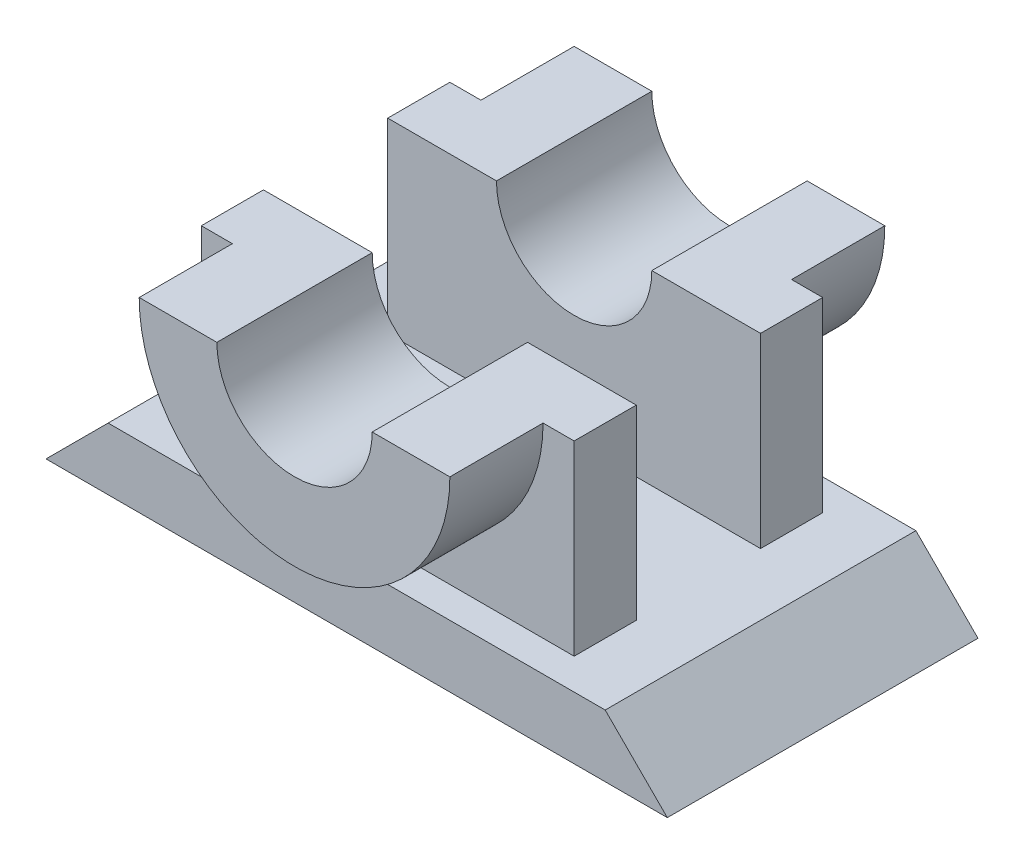
ISO-10303-21;
HEADER;
FILE_DESCRIPTION(('STEP AP214'),'2;1');
FILE_NAME('part.step','',(''),(''),'','','');
FILE_SCHEMA(('AUTOMOTIVE_DESIGN { 1 0 10303 214 1 1 1 1 }'));
ENDSEC;
DATA;
#1=APPLICATION_CONTEXT('core data for automotive mechanical design processes');
#2=APPLICATION_PROTOCOL_DEFINITION('international standard','automotive_design',2000,#1);
#3=PRODUCT_CONTEXT('',#1,'mechanical');
#4=PRODUCT('Part','Part','',(#3));
#5=PRODUCT_RELATED_PRODUCT_CATEGORY('part','',(#4));
#6=PRODUCT_DEFINITION_FORMATION('','',#4);
#7=PRODUCT_DEFINITION_CONTEXT('part definition',#1,'design');
#8=PRODUCT_DEFINITION('design','',#6,#7);
#9=PRODUCT_DEFINITION_SHAPE('','',#8);
#10=(LENGTH_UNIT() NAMED_UNIT(*) SI_UNIT(.MILLI.,.METRE.));
#11=(NAMED_UNIT(*) PLANE_ANGLE_UNIT() SI_UNIT($,.RADIAN.));
#12=(NAMED_UNIT(*) SI_UNIT($,.STERADIAN.) SOLID_ANGLE_UNIT());
#13=UNCERTAINTY_MEASURE_WITH_UNIT(LENGTH_MEASURE(1.E-05),#10,'distance_accuracy_value','');
#14=(GEOMETRIC_REPRESENTATION_CONTEXT(3) GLOBAL_UNCERTAINTY_ASSIGNED_CONTEXT((#13)) GLOBAL_UNIT_ASSIGNED_CONTEXT((#10,
#11,#12)) REPRESENTATION_CONTEXT('',''));
#15=CARTESIAN_POINT('',(0.,0.,0.));
#16=DIRECTION('',(0.,0.,1.));
#17=DIRECTION('',(1.,0.,0.));
#18=AXIS2_PLACEMENT_3D('',#15,#16,#17);
#19=CARTESIAN_POINT('',(-30.,40.,-20.));
#20=DIRECTION('',(0.,0.,1.));
#21=DIRECTION('',(1.,0.,0.));
#22=AXIS2_PLACEMENT_3D('',#19,#20,#21);
#23=PLANE('',#22);
#24=CARTESIAN_POINT('',(0.,40.,-20.));
#25=DIRECTION('',(0.,0.,-1.));
#26=DIRECTION('',(-1.,0.,0.));
#27=AXIS2_PLACEMENT_3D('',#24,#25,#26);
#28=CIRCLE('',#27,25.);
#29=CARTESIAN_POINT('',(25.,40.,-20.));
#30=VERTEX_POINT('',#29);
#31=CARTESIAN_POINT('',(-25.,40.,-20.));
#32=VERTEX_POINT('',#31);
#33=EDGE_CURVE('E56',#30,#32,#28,.T.);
#34=ORIENTED_EDGE('',*,*,#33,.F.);
#35=DIRECTION('',(-1.,0.,0.));
#36=VECTOR('',#35,1.);
#37=CARTESIAN_POINT('',(-30.,40.,-20.));
#38=LINE('',#37,#36);
#39=CARTESIAN_POINT('',(30.,40.,-20.));
#40=VERTEX_POINT('',#39);
#41=EDGE_CURVE('E280',#40,#30,#38,.T.);
#42=ORIENTED_EDGE('',*,*,#41,.F.);
#43=DIRECTION('',(0.,-1.,0.));
#44=VECTOR('',#43,1.);
#45=CARTESIAN_POINT('',(30.,40.,-20.));
#46=LINE('',#45,#44);
#47=CARTESIAN_POINT('',(30.,10.,-20.));
#48=VERTEX_POINT('',#47);
#49=EDGE_CURVE('E266',#40,#48,#46,.T.);
#50=ORIENTED_EDGE('',*,*,#49,.T.);
#51=DIRECTION('',(1.,0.,0.));
#52=VECTOR('',#51,1.);
#53=CARTESIAN_POINT('',(0.,10.,-20.));
#54=LINE('',#53,#52);
#55=CARTESIAN_POINT('',(-30.,10.,-20.));
#56=VERTEX_POINT('',#55);
#57=EDGE_CURVE('E281',#56,#48,#54,.T.);
#58=ORIENTED_EDGE('',*,*,#57,.F.);
#59=DIRECTION('',(0.,-1.,0.));
#60=VECTOR('',#59,1.);
#61=CARTESIAN_POINT('',(-30.,40.,-20.));
#62=LINE('',#61,#60);
#63=CARTESIAN_POINT('',(-30.,40.,-20.));
#64=VERTEX_POINT('',#63);
#65=EDGE_CURVE('E267',#64,#56,#62,.T.);
#66=ORIENTED_EDGE('',*,*,#65,.F.);
#67=EDGE_CURVE('E277',#32,#64,#38,.T.);
#68=ORIENTED_EDGE('',*,*,#67,.F.);
#69=EDGE_LOOP('',(#34,#42,#50,#58,#66,#68));
#70=FACE_BOUND('',#69,.T.);
#71=ADVANCED_FACE('F43',(#70),#23,.F.);
#72=CARTESIAN_POINT('',(-30.,40.,20.));
#73=DIRECTION('',(0.,0.,-1.));
#74=DIRECTION('',(-1.,0.,0.));
#75=AXIS2_PLACEMENT_3D('',#72,#73,#74);
#76=PLANE('',#75);
#77=CARTESIAN_POINT('',(0.,40.,20.));
#78=DIRECTION('',(0.,0.,1.));
#79=DIRECTION('',(1.,0.,0.));
#80=AXIS2_PLACEMENT_3D('',#77,#78,#79);
#81=CIRCLE('',#80,25.);
#82=CARTESIAN_POINT('',(-25.,40.,20.));
#83=VERTEX_POINT('',#82);
#84=CARTESIAN_POINT('',(25.,40.,20.));
#85=VERTEX_POINT('',#84);
#86=EDGE_CURVE('E70',#83,#85,#81,.T.);
#87=ORIENTED_EDGE('',*,*,#86,.F.);
#88=DIRECTION('',(1.,0.,0.));
#89=VECTOR('',#88,1.);
#90=CARTESIAN_POINT('',(-30.,40.,20.));
#91=LINE('',#90,#89);
#92=CARTESIAN_POINT('',(-30.,40.,20.));
#93=VERTEX_POINT('',#92);
#94=EDGE_CURVE('E249',#93,#83,#91,.T.);
#95=ORIENTED_EDGE('',*,*,#94,.F.);
#96=DIRECTION('',(0.,-1.,0.));
#97=VECTOR('',#96,1.);
#98=CARTESIAN_POINT('',(-30.,40.,20.));
#99=LINE('',#98,#97);
#100=CARTESIAN_POINT('',(-30.,10.,20.));
#101=VERTEX_POINT('',#100);
#102=EDGE_CURVE('E254',#93,#101,#99,.T.);
#103=ORIENTED_EDGE('',*,*,#102,.T.);
#104=DIRECTION('',(-1.,0.,0.));
#105=VECTOR('',#104,1.);
#106=CARTESIAN_POINT('',(0.,10.,20.));
#107=LINE('',#106,#105);
#108=CARTESIAN_POINT('',(30.,10.,20.));
#109=VERTEX_POINT('',#108);
#110=EDGE_CURVE('E294',#109,#101,#107,.T.);
#111=ORIENTED_EDGE('',*,*,#110,.F.);
#112=DIRECTION('',(0.,-1.,0.));
#113=VECTOR('',#112,1.);
#114=CARTESIAN_POINT('',(30.,40.,20.));
#115=LINE('',#114,#113);
#116=CARTESIAN_POINT('',(30.,40.,20.));
#117=VERTEX_POINT('',#116);
#118=EDGE_CURVE('E252',#117,#109,#115,.T.);
#119=ORIENTED_EDGE('',*,*,#118,.F.);
#120=EDGE_CURVE('E248',#85,#117,#91,.T.);
#121=ORIENTED_EDGE('',*,*,#120,.F.);
#122=EDGE_LOOP('',(#87,#95,#103,#111,#119,#121));
#123=FACE_BOUND('',#122,.T.);
#124=ADVANCED_FACE('F365',(#123),#76,.F.);
#125=CARTESIAN_POINT('',(0.,40.,0.));
#126=DIRECTION('',(0.,1.,0.));
#127=DIRECTION('',(0.,0.,1.));
#128=AXIS2_PLACEMENT_3D('',#125,#126,#127);
#129=PLANE('',#128);
#130=ORIENTED_EDGE('',*,*,#41,.T.);
#131=DIRECTION('',(0.,0.,1.));
#132=VECTOR('',#131,1.);
#133=CARTESIAN_POINT('',(25.,40.,-35.));
#134=LINE('',#133,#132);
#135=CARTESIAN_POINT('',(25.,40.,-35.));
#136=VERTEX_POINT('',#135);
#137=EDGE_CURVE('E204',#136,#30,#134,.T.);
#138=ORIENTED_EDGE('',*,*,#137,.F.);
#139=DIRECTION('',(1.,0.,0.));
#140=VECTOR('',#139,1.);
#141=CARTESIAN_POINT('',(12.5,40.,-35.));
#142=LINE('',#141,#140);
#143=CARTESIAN_POINT('',(12.5,40.,-35.));
#144=VERTEX_POINT('',#143);
#145=EDGE_CURVE('E196',#144,#136,#142,.T.);
#146=ORIENTED_EDGE('',*,*,#145,.F.);
#147=DIRECTION('',(0.,0.,1.));
#148=VECTOR('',#147,1.);
#149=CARTESIAN_POINT('',(12.5,40.,-44.));
#150=LINE('',#149,#148);
#151=CARTESIAN_POINT('',(12.5,40.,-9.99999999999999));
#152=VERTEX_POINT('',#151);
#153=EDGE_CURVE('E226',#144,#152,#150,.T.);
#154=ORIENTED_EDGE('',*,*,#153,.T.);
#155=DIRECTION('',(1.,0.,0.));
#156=VECTOR('',#155,1.);
#157=CARTESIAN_POINT('',(-30.,40.,-9.99999999999999));
#158=LINE('',#157,#156);
#159=CARTESIAN_POINT('',(30.,40.,-9.99999999999999));
#160=VERTEX_POINT('',#159);
#161=EDGE_CURVE('E283',#152,#160,#158,.T.);
#162=ORIENTED_EDGE('',*,*,#161,.T.);
#163=DIRECTION('',(0.,0.,-1.));
#164=VECTOR('',#163,1.);
#165=CARTESIAN_POINT('',(30.,40.,-9.99999999999999));
#166=LINE('',#165,#164);
#167=EDGE_CURVE('E276',#160,#40,#166,.T.);
#168=ORIENTED_EDGE('',*,*,#167,.T.);
#169=EDGE_LOOP('',(#130,#138,#146,#154,#162,#168));
#170=FACE_BOUND('',#169,.T.);
#171=ADVANCED_FACE('F371',(#170),#129,.T.);
#172=CARTESIAN_POINT('',(0.,40.,0.));
#173=DIRECTION('',(0.,1.,0.));
#174=DIRECTION('',(0.,0.,1.));
#175=AXIS2_PLACEMENT_3D('',#172,#173,#174);
#176=PLANE('',#175);
#177=DIRECTION('',(-1.,0.,0.));
#178=VECTOR('',#177,1.);
#179=CARTESIAN_POINT('',(-30.,40.,9.99999999999999));
#180=LINE('',#179,#178);
#181=CARTESIAN_POINT('',(30.,40.,9.99999999999999));
#182=VERTEX_POINT('',#181);
#183=CARTESIAN_POINT('',(12.5,40.,9.99999999999999));
#184=VERTEX_POINT('',#183);
#185=EDGE_CURVE('E245',#182,#184,#180,.T.);
#186=ORIENTED_EDGE('',*,*,#185,.T.);
#187=CARTESIAN_POINT('',(12.5,40.,35.));
#188=VERTEX_POINT('',#187);
#189=EDGE_CURVE('E229',#184,#188,#150,.T.);
#190=ORIENTED_EDGE('',*,*,#189,.T.);
#191=DIRECTION('',(-1.,0.,0.));
#192=VECTOR('',#191,1.);
#193=CARTESIAN_POINT('',(12.5,40.,35.));
#194=LINE('',#193,#192);
#195=CARTESIAN_POINT('',(25.,40.,35.));
#196=VERTEX_POINT('',#195);
#197=EDGE_CURVE('E213',#196,#188,#194,.T.);
#198=ORIENTED_EDGE('',*,*,#197,.F.);
#199=DIRECTION('',(0.,0.,-1.));
#200=VECTOR('',#199,1.);
#201=CARTESIAN_POINT('',(25.,40.,35.));
#202=LINE('',#201,#200);
#203=EDGE_CURVE('E221',#196,#85,#202,.T.);
#204=ORIENTED_EDGE('',*,*,#203,.T.);
#205=ORIENTED_EDGE('',*,*,#120,.T.);
#206=DIRECTION('',(0.,0.,-1.));
#207=VECTOR('',#206,1.);
#208=CARTESIAN_POINT('',(30.,40.,9.99999999999999));
#209=LINE('',#208,#207);
#210=EDGE_CURVE('E239',#117,#182,#209,.T.);
#211=ORIENTED_EDGE('',*,*,#210,.T.);
#212=EDGE_LOOP('',(#186,#190,#198,#204,#205,#211));
#213=FACE_BOUND('',#212,.T.);
#214=ADVANCED_FACE('F384',(#213),#176,.T.);
#215=CARTESIAN_POINT('',(0.,10.,0.));
#216=DIRECTION('',(0.,1.,0.));
#217=DIRECTION('',(0.,0.,1.));
#218=AXIS2_PLACEMENT_3D('',#215,#216,#217);
#219=PLANE('',#218);
#220=DIRECTION('',(1.,0.,0.));
#221=VECTOR('',#220,1.);
#222=CARTESIAN_POINT('',(-50.,10.,25.));
#223=LINE('',#222,#221);
#224=CARTESIAN_POINT('',(-40.,10.,25.));
#225=VERTEX_POINT('',#224);
#226=CARTESIAN_POINT('',(40.,10.,25.));
#227=VERTEX_POINT('',#226);
#228=EDGE_CURVE('E310',#225,#227,#223,.T.);
#229=ORIENTED_EDGE('',*,*,#228,.T.);
#230=DIRECTION('',(0.,0.,-1.));
#231=VECTOR('',#230,1.);
#232=CARTESIAN_POINT('',(40.,10.,-25.));
#233=LINE('',#232,#231);
#234=CARTESIAN_POINT('',(40.,10.,-25.));
#235=VERTEX_POINT('',#234);
#236=EDGE_CURVE('E328',#227,#235,#233,.T.);
#237=ORIENTED_EDGE('',*,*,#236,.T.);
#238=DIRECTION('',(-1.,0.,0.));
#239=VECTOR('',#238,1.);
#240=CARTESIAN_POINT('',(-50.,10.,-25.));
#241=LINE('',#240,#239);
#242=CARTESIAN_POINT('',(-40.,10.,-25.));
#243=VERTEX_POINT('',#242);
#244=EDGE_CURVE('E307',#235,#243,#241,.T.);
#245=ORIENTED_EDGE('',*,*,#244,.T.);
#246=DIRECTION('',(0.,0.,1.));
#247=VECTOR('',#246,1.);
#248=CARTESIAN_POINT('',(-40.,10.,25.));
#249=LINE('',#248,#247);
#250=EDGE_CURVE('E311',#243,#225,#249,.T.);
#251=ORIENTED_EDGE('',*,*,#250,.T.);
#252=EDGE_LOOP('',(#229,#237,#245,#251));
#253=FACE_BOUND('',#252,.T.);
#254=DIRECTION('',(0.,0.,1.));
#255=VECTOR('',#254,1.);
#256=CARTESIAN_POINT('',(30.,10.,0.));
#257=LINE('',#256,#255);
#258=CARTESIAN_POINT('',(30.,10.,-9.99999999999999));
#259=VERTEX_POINT('',#258);
#260=EDGE_CURVE('E287',#48,#259,#257,.T.);
#261=ORIENTED_EDGE('',*,*,#260,.T.);
#262=DIRECTION('',(-1.,0.,0.));
#263=VECTOR('',#262,1.);
#264=CARTESIAN_POINT('',(0.,10.,-9.99999999999999));
#265=LINE('',#264,#263);
#266=CARTESIAN_POINT('',(-30.,10.,-9.99999999999999));
#267=VERTEX_POINT('',#266);
#268=EDGE_CURVE('E292',#259,#267,#265,.T.);
#269=ORIENTED_EDGE('',*,*,#268,.T.);
#270=DIRECTION('',(0.,0.,-1.));
#271=VECTOR('',#270,1.);
#272=CARTESIAN_POINT('',(-30.,10.,0.));
#273=LINE('',#272,#271);
#274=EDGE_CURVE('E263',#267,#56,#273,.T.);
#275=ORIENTED_EDGE('',*,*,#274,.T.);
#276=ORIENTED_EDGE('',*,*,#57,.T.);
#277=EDGE_LOOP('',(#261,#269,#275,#276));
#278=FACE_BOUND('',#277,.T.);
#279=DIRECTION('',(1.,0.,0.));
#280=VECTOR('',#279,1.);
#281=CARTESIAN_POINT('',(0.,10.,9.99999999999999));
#282=LINE('',#281,#280);
#283=CARTESIAN_POINT('',(-30.,10.,9.99999999999999));
#284=VERTEX_POINT('',#283);
#285=CARTESIAN_POINT('',(30.,10.,9.99999999999999));
#286=VERTEX_POINT('',#285);
#287=EDGE_CURVE('E296',#284,#286,#282,.T.);
#288=ORIENTED_EDGE('',*,*,#287,.T.);
#289=DIRECTION('',(0.,0.,1.));
#290=VECTOR('',#289,1.);
#291=CARTESIAN_POINT('',(30.,10.,0.));
#292=LINE('',#291,#290);
#293=EDGE_CURVE('E302',#286,#109,#292,.T.);
#294=ORIENTED_EDGE('',*,*,#293,.T.);
#295=ORIENTED_EDGE('',*,*,#110,.T.);
#296=DIRECTION('',(0.,0.,-1.));
#297=VECTOR('',#296,1.);
#298=CARTESIAN_POINT('',(-30.,10.,0.));
#299=LINE('',#298,#297);
#300=EDGE_CURVE('E299',#101,#284,#299,.T.);
#301=ORIENTED_EDGE('',*,*,#300,.T.);
#302=EDGE_LOOP('',(#288,#294,#295,#301));
#303=FACE_BOUND('',#302,.T.);
#304=ADVANCED_FACE('F346',(#253,#278,#303),#219,.T.);
#305=CARTESIAN_POINT('',(-50.,10.,-25.));
#306=DIRECTION('',(0.,0.,1.));
#307=DIRECTION('',(1.,0.,0.));
#308=AXIS2_PLACEMENT_3D('',#305,#306,#307);
#309=PLANE('',#308);
#310=ORIENTED_EDGE('',*,*,#244,.F.);
#311=DIRECTION('',(0.707106781186546,-0.707106781186549,0.));
#312=VECTOR('',#311,1.);
#313=CARTESIAN_POINT('',(40.,10.,-25.));
#314=LINE('',#313,#312);
#315=CARTESIAN_POINT('',(50.,0.,-25.));
#316=VERTEX_POINT('',#315);
#317=EDGE_CURVE('E55',#235,#316,#314,.T.);
#318=ORIENTED_EDGE('',*,*,#317,.T.);
#319=DIRECTION('',(-1.,0.,0.));
#320=VECTOR('',#319,1.);
#321=CARTESIAN_POINT('',(-50.,0.,-25.));
#322=LINE('',#321,#320);
#323=CARTESIAN_POINT('',(-50.,0.,-25.));
#324=VERTEX_POINT('',#323);
#325=EDGE_CURVE('E316',#316,#324,#322,.T.);
#326=ORIENTED_EDGE('',*,*,#325,.T.);
#327=DIRECTION('',(0.707106781186547,0.707106781186549,0.));
#328=VECTOR('',#327,1.);
#329=CARTESIAN_POINT('',(-40.,10.,-25.));
#330=LINE('',#329,#328);
#331=EDGE_CURVE('E326',#324,#243,#330,.T.);
#332=ORIENTED_EDGE('',*,*,#331,.T.);
#333=EDGE_LOOP('',(#310,#318,#326,#332));
#334=FACE_BOUND('',#333,.T.);
#335=ADVANCED_FACE('F331',(#334),#309,.F.);
#336=CARTESIAN_POINT('',(-50.,10.,25.));
#337=DIRECTION('',(0.,0.,-1.));
#338=DIRECTION('',(-1.,0.,0.));
#339=AXIS2_PLACEMENT_3D('',#336,#337,#338);
#340=PLANE('',#339);
#341=DIRECTION('',(1.,0.,0.));
#342=VECTOR('',#341,1.);
#343=CARTESIAN_POINT('',(-50.,0.,25.));
#344=LINE('',#343,#342);
#345=CARTESIAN_POINT('',(-50.,0.,25.));
#346=VERTEX_POINT('',#345);
#347=CARTESIAN_POINT('',(50.,0.,25.));
#348=VERTEX_POINT('',#347);
#349=EDGE_CURVE('E309',#346,#348,#344,.T.);
#350=ORIENTED_EDGE('',*,*,#349,.T.);
#351=DIRECTION('',(-0.707106781186546,0.707106781186549,0.));
#352=VECTOR('',#351,1.);
#353=CARTESIAN_POINT('',(40.,10.,25.));
#354=LINE('',#353,#352);
#355=EDGE_CURVE('E11',#348,#227,#354,.T.);
#356=ORIENTED_EDGE('',*,*,#355,.T.);
#357=ORIENTED_EDGE('',*,*,#228,.F.);
#358=DIRECTION('',(-0.707106781186547,-0.707106781186549,0.));
#359=VECTOR('',#358,1.);
#360=CARTESIAN_POINT('',(-40.,10.,25.));
#361=LINE('',#360,#359);
#362=EDGE_CURVE('E322',#225,#346,#361,.T.);
#363=ORIENTED_EDGE('',*,*,#362,.T.);
#364=EDGE_LOOP('',(#350,#356,#357,#363));
#365=FACE_BOUND('',#364,.T.);
#366=ADVANCED_FACE('F347',(#365),#340,.F.);
#367=CARTESIAN_POINT('',(0.,0.,0.));
#368=DIRECTION('',(0.,1.,0.));
#369=DIRECTION('',(0.,0.,1.));
#370=AXIS2_PLACEMENT_3D('',#367,#368,#369);
#371=PLANE('',#370);
#372=DIRECTION('',(0.,0.,-1.));
#373=VECTOR('',#372,1.);
#374=CARTESIAN_POINT('',(50.,0.,-25.));
#375=LINE('',#374,#373);
#376=EDGE_CURVE('E308',#348,#316,#375,.T.);
#377=ORIENTED_EDGE('',*,*,#376,.F.);
#378=ORIENTED_EDGE('',*,*,#349,.F.);
#379=DIRECTION('',(0.,0.,1.));
#380=VECTOR('',#379,1.);
#381=CARTESIAN_POINT('',(-50.,0.,-25.));
#382=LINE('',#381,#380);
#383=EDGE_CURVE('E318',#324,#346,#382,.T.);
#384=ORIENTED_EDGE('',*,*,#383,.F.);
#385=ORIENTED_EDGE('',*,*,#325,.F.);
#386=EDGE_LOOP('',(#377,#378,#384,#385));
#387=FACE_BOUND('',#386,.T.);
#388=ADVANCED_FACE('F336',(#387),#371,.F.);
#389=CARTESIAN_POINT('',(-40.,10.,0.));
#390=DIRECTION('',(-0.707106781186549,0.707106781186547,0.));
#391=DIRECTION('',(0.,0.,-1.));
#392=AXIS2_PLACEMENT_3D('',#389,#390,#391);
#393=PLANE('',#392);
#394=ORIENTED_EDGE('',*,*,#331,.F.);
#395=ORIENTED_EDGE('',*,*,#383,.T.);
#396=ORIENTED_EDGE('',*,*,#362,.F.);
#397=ORIENTED_EDGE('',*,*,#250,.F.);
#398=EDGE_LOOP('',(#394,#395,#396,#397));
#399=FACE_BOUND('',#398,.T.);
#400=ADVANCED_FACE('F354',(#399),#393,.T.);
#401=CARTESIAN_POINT('',(40.,10.,0.));
#402=DIRECTION('',(0.707106781186549,0.707106781186546,0.));
#403=DIRECTION('',(0.,0.,1.));
#404=AXIS2_PLACEMENT_3D('',#401,#402,#403);
#405=PLANE('',#404);
#406=ORIENTED_EDGE('',*,*,#355,.F.);
#407=ORIENTED_EDGE('',*,*,#376,.T.);
#408=ORIENTED_EDGE('',*,*,#317,.F.);
#409=ORIENTED_EDGE('',*,*,#236,.F.);
#410=EDGE_LOOP('',(#406,#407,#408,#409));
#411=FACE_BOUND('',#410,.T.);
#412=ADVANCED_FACE('F46',(#411),#405,.T.);
#413=CARTESIAN_POINT('',(-30.,40.,-9.99999999999999));
#414=DIRECTION('',(0.,0.,-1.));
#415=DIRECTION('',(-1.,0.,0.));
#416=AXIS2_PLACEMENT_3D('',#413,#414,#415);
#417=PLANE('',#416);
#418=ORIENTED_EDGE('',*,*,#161,.F.);
#419=CARTESIAN_POINT('',(0.,40.,-9.99999999999999));
#420=DIRECTION('',(0.,0.,-1.));
#421=DIRECTION('',(-1.,0.,0.));
#422=AXIS2_PLACEMENT_3D('',#419,#420,#421);
#423=CIRCLE('',#422,12.5);
#424=CARTESIAN_POINT('',(-12.5,40.,-9.99999999999999));
#425=VERTEX_POINT('',#424);
#426=EDGE_CURVE('E234',#152,#425,#423,.T.);
#427=ORIENTED_EDGE('',*,*,#426,.T.);
#428=CARTESIAN_POINT('',(-30.,40.,-9.99999999999999));
#429=VERTEX_POINT('',#428);
#430=EDGE_CURVE('E242',#429,#425,#158,.T.);
#431=ORIENTED_EDGE('',*,*,#430,.F.);
#432=DIRECTION('',(0.,-1.,0.));
#433=VECTOR('',#432,1.);
#434=CARTESIAN_POINT('',(-30.,40.,-9.99999999999999));
#435=LINE('',#434,#433);
#436=EDGE_CURVE('E271',#429,#267,#435,.T.);
#437=ORIENTED_EDGE('',*,*,#436,.T.);
#438=ORIENTED_EDGE('',*,*,#268,.F.);
#439=DIRECTION('',(0.,-1.,0.));
#440=VECTOR('',#439,1.);
#441=CARTESIAN_POINT('',(30.,40.,-9.99999999999999));
#442=LINE('',#441,#440);
#443=EDGE_CURVE('E236',#160,#259,#442,.T.);
#444=ORIENTED_EDGE('',*,*,#443,.F.);
#445=EDGE_LOOP('',(#418,#427,#431,#437,#438,#444));
#446=FACE_BOUND('',#445,.T.);
#447=ADVANCED_FACE('F357',(#446),#417,.F.);
#448=CARTESIAN_POINT('',(30.,40.,-9.99999999999999));
#449=DIRECTION('',(-1.,0.,0.));
#450=DIRECTION('',(0.,0.,1.));
#451=AXIS2_PLACEMENT_3D('',#448,#449,#450);
#452=PLANE('',#451);
#453=ORIENTED_EDGE('',*,*,#260,.F.);
#454=ORIENTED_EDGE('',*,*,#49,.F.);
#455=ORIENTED_EDGE('',*,*,#167,.F.);
#456=ORIENTED_EDGE('',*,*,#443,.T.);
#457=EDGE_LOOP('',(#453,#454,#455,#456));
#458=FACE_BOUND('',#457,.T.);
#459=ADVANCED_FACE('F374',(#458),#452,.F.);
#460=CARTESIAN_POINT('',(-30.,40.,-9.99999999999999));
#461=DIRECTION('',(1.,0.,0.));
#462=DIRECTION('',(0.,0.,-1.));
#463=AXIS2_PLACEMENT_3D('',#460,#461,#462);
#464=PLANE('',#463);
#465=ORIENTED_EDGE('',*,*,#274,.F.);
#466=ORIENTED_EDGE('',*,*,#436,.F.);
#467=DIRECTION('',(0.,0.,1.));
#468=VECTOR('',#467,1.);
#469=CARTESIAN_POINT('',(-30.,40.,-9.99999999999999));
#470=LINE('',#469,#468);
#471=EDGE_CURVE('E273',#64,#429,#470,.T.);
#472=ORIENTED_EDGE('',*,*,#471,.F.);
#473=ORIENTED_EDGE('',*,*,#65,.T.);
#474=EDGE_LOOP('',(#465,#466,#472,#473));
#475=FACE_BOUND('',#474,.T.);
#476=ADVANCED_FACE('F380',(#475),#464,.F.);
#477=DIRECTION('',(0.,0.,1.));
#478=VECTOR('',#477,1.);
#479=CARTESIAN_POINT('',(-12.5,40.,-44.));
#480=LINE('',#479,#478);
#481=CARTESIAN_POINT('',(-12.5,40.,-35.));
#482=VERTEX_POINT('',#481);
#483=EDGE_CURVE('E187',#482,#425,#480,.T.);
#484=ORIENTED_EDGE('',*,*,#483,.F.);
#485=DIRECTION('',(1.,0.,0.));
#486=VECTOR('',#485,1.);
#487=CARTESIAN_POINT('',(-12.5,40.,-35.));
#488=LINE('',#487,#486);
#489=CARTESIAN_POINT('',(-25.,40.,-35.));
#490=VERTEX_POINT('',#489);
#491=EDGE_CURVE('E185',#490,#482,#488,.T.);
#492=ORIENTED_EDGE('',*,*,#491,.F.);
#493=DIRECTION('',(0.,0.,1.));
#494=VECTOR('',#493,1.);
#495=CARTESIAN_POINT('',(-25.,40.,-35.));
#496=LINE('',#495,#494);
#497=EDGE_CURVE('E188',#490,#32,#496,.T.);
#498=ORIENTED_EDGE('',*,*,#497,.T.);
#499=ORIENTED_EDGE('',*,*,#67,.T.);
#500=ORIENTED_EDGE('',*,*,#471,.T.);
#501=ORIENTED_EDGE('',*,*,#430,.T.);
#502=EDGE_LOOP('',(#484,#492,#498,#499,#500,#501));
#503=FACE_BOUND('',#502,.T.);
#504=ADVANCED_FACE('F184',(#503),#129,.T.);
#505=CARTESIAN_POINT('',(30.,40.,9.99999999999999));
#506=DIRECTION('',(-1.,0.,0.));
#507=DIRECTION('',(0.,0.,1.));
#508=AXIS2_PLACEMENT_3D('',#505,#506,#507);
#509=PLANE('',#508);
#510=ORIENTED_EDGE('',*,*,#293,.F.);
#511=DIRECTION('',(0.,-1.,0.));
#512=VECTOR('',#511,1.);
#513=CARTESIAN_POINT('',(30.,40.,9.99999999999999));
#514=LINE('',#513,#512);
#515=EDGE_CURVE('E257',#182,#286,#514,.T.);
#516=ORIENTED_EDGE('',*,*,#515,.F.);
#517=ORIENTED_EDGE('',*,*,#210,.F.);
#518=ORIENTED_EDGE('',*,*,#118,.T.);
#519=EDGE_LOOP('',(#510,#516,#517,#518));
#520=FACE_BOUND('',#519,.T.);
#521=ADVANCED_FACE('F382',(#520),#509,.F.);
#522=CARTESIAN_POINT('',(-30.,40.,9.99999999999999));
#523=DIRECTION('',(0.,0.,1.));
#524=DIRECTION('',(1.,0.,0.));
#525=AXIS2_PLACEMENT_3D('',#522,#523,#524);
#526=PLANE('',#525);
#527=CARTESIAN_POINT('',(-12.5,40.,9.99999999999999));
#528=VERTEX_POINT('',#527);
#529=CARTESIAN_POINT('',(-30.,40.,9.99999999999999));
#530=VERTEX_POINT('',#529);
#531=EDGE_CURVE('E244',#528,#530,#180,.T.);
#532=ORIENTED_EDGE('',*,*,#531,.F.);
#533=CARTESIAN_POINT('',(0.,40.,9.99999999999999));
#534=DIRECTION('',(0.,0.,1.));
#535=DIRECTION('',(1.,0.,0.));
#536=AXIS2_PLACEMENT_3D('',#533,#534,#535);
#537=CIRCLE('',#536,12.5);
#538=EDGE_CURVE('E235',#528,#184,#537,.T.);
#539=ORIENTED_EDGE('',*,*,#538,.T.);
#540=ORIENTED_EDGE('',*,*,#185,.F.);
#541=ORIENTED_EDGE('',*,*,#515,.T.);
#542=ORIENTED_EDGE('',*,*,#287,.F.);
#543=DIRECTION('',(0.,-1.,0.));
#544=VECTOR('',#543,1.);
#545=CARTESIAN_POINT('',(-30.,40.,9.99999999999999));
#546=LINE('',#545,#544);
#547=EDGE_CURVE('E260',#530,#284,#546,.T.);
#548=ORIENTED_EDGE('',*,*,#547,.F.);
#549=EDGE_LOOP('',(#532,#539,#540,#541,#542,#548));
#550=FACE_BOUND('',#549,.T.);
#551=ADVANCED_FACE('F431',(#550),#526,.F.);
#552=CARTESIAN_POINT('',(-30.,40.,9.99999999999999));
#553=DIRECTION('',(1.,0.,0.));
#554=DIRECTION('',(0.,0.,-1.));
#555=AXIS2_PLACEMENT_3D('',#552,#553,#554);
#556=PLANE('',#555);
#557=ORIENTED_EDGE('',*,*,#300,.F.);
#558=ORIENTED_EDGE('',*,*,#102,.F.);
#559=DIRECTION('',(0.,0.,1.));
#560=VECTOR('',#559,1.);
#561=CARTESIAN_POINT('',(-30.,40.,9.99999999999999));
#562=LINE('',#561,#560);
#563=EDGE_CURVE('E250',#530,#93,#562,.T.);
#564=ORIENTED_EDGE('',*,*,#563,.F.);
#565=ORIENTED_EDGE('',*,*,#547,.T.);
#566=EDGE_LOOP('',(#557,#558,#564,#565));
#567=FACE_BOUND('',#566,.T.);
#568=ADVANCED_FACE('F437',(#567),#556,.F.);
#569=CARTESIAN_POINT('',(-12.5,39.9999999999999,35.));
#570=VERTEX_POINT('',#569);
#571=EDGE_CURVE('E227',#528,#570,#480,.T.);
#572=ORIENTED_EDGE('',*,*,#571,.F.);
#573=ORIENTED_EDGE('',*,*,#531,.T.);
#574=ORIENTED_EDGE('',*,*,#563,.T.);
#575=ORIENTED_EDGE('',*,*,#94,.T.);
#576=DIRECTION('',(0.,0.,-1.));
#577=VECTOR('',#576,1.);
#578=CARTESIAN_POINT('',(-25.,40.,35.));
#579=LINE('',#578,#577);
#580=CARTESIAN_POINT('',(-25.,40.,35.));
#581=VERTEX_POINT('',#580);
#582=EDGE_CURVE('E219',#581,#83,#579,.T.);
#583=ORIENTED_EDGE('',*,*,#582,.F.);
#584=DIRECTION('',(-1.,0.,0.));
#585=VECTOR('',#584,1.);
#586=CARTESIAN_POINT('',(-25.,40.,35.));
#587=LINE('',#586,#585);
#588=EDGE_CURVE('E218',#570,#581,#587,.T.);
#589=ORIENTED_EDGE('',*,*,#588,.F.);
#590=EDGE_LOOP('',(#572,#573,#574,#575,#583,#589));
#591=FACE_BOUND('',#590,.T.);
#592=ADVANCED_FACE('F445',(#591),#176,.T.);
#593=CARTESIAN_POINT('',(0.,40.,-44.));
#594=DIRECTION('',(0.,0.,1.));
#595=DIRECTION('',(1.,0.,0.));
#596=AXIS2_PLACEMENT_3D('',#593,#594,#595);
#597=CYLINDRICAL_SURFACE('',#596,12.5);
#598=ORIENTED_EDGE('',*,*,#571,.T.);
#599=CARTESIAN_POINT('',(0.,40.,35.));
#600=DIRECTION('',(0.,0.,-1.));
#601=DIRECTION('',(1.,0.,0.));
#602=AXIS2_PLACEMENT_3D('',#599,#600,#601);
#603=CIRCLE('',#602,12.5);
#604=EDGE_CURVE('E216',#188,#570,#603,.T.);
#605=ORIENTED_EDGE('',*,*,#604,.F.);
#606=ORIENTED_EDGE('',*,*,#189,.F.);
#607=ORIENTED_EDGE('',*,*,#538,.F.);
#608=EDGE_LOOP('',(#598,#605,#606,#607));
#609=FACE_BOUND('',#608,.T.);
#610=ADVANCED_FACE('F479',(#609),#597,.F.);
#611=ORIENTED_EDGE('',*,*,#153,.F.);
#612=CARTESIAN_POINT('',(0.,40.,-35.));
#613=DIRECTION('',(0.,0.,1.));
#614=DIRECTION('',(-1.,0.,0.));
#615=AXIS2_PLACEMENT_3D('',#612,#613,#614);
#616=CIRCLE('',#615,12.5);
#617=EDGE_CURVE('E195',#482,#144,#616,.T.);
#618=ORIENTED_EDGE('',*,*,#617,.F.);
#619=ORIENTED_EDGE('',*,*,#483,.T.);
#620=ORIENTED_EDGE('',*,*,#426,.F.);
#621=EDGE_LOOP('',(#611,#618,#619,#620));
#622=FACE_BOUND('',#621,.T.);
#623=ADVANCED_FACE('F486',(#622),#597,.F.);
#624=CARTESIAN_POINT('',(0.,40.,35.));
#625=DIRECTION('',(0.,0.,-1.));
#626=DIRECTION('',(-1.,0.,0.));
#627=AXIS2_PLACEMENT_3D('',#624,#625,#626);
#628=CYLINDRICAL_SURFACE('',#627,25.);
#629=ORIENTED_EDGE('',*,*,#86,.T.);
#630=ORIENTED_EDGE('',*,*,#203,.F.);
#631=CARTESIAN_POINT('',(0.,40.,35.));
#632=DIRECTION('',(0.,0.,1.));
#633=DIRECTION('',(1.,0.,0.));
#634=AXIS2_PLACEMENT_3D('',#631,#632,#633);
#635=CIRCLE('',#634,25.);
#636=EDGE_CURVE('E206',#581,#196,#635,.T.);
#637=ORIENTED_EDGE('',*,*,#636,.F.);
#638=ORIENTED_EDGE('',*,*,#582,.T.);
#639=EDGE_LOOP('',(#629,#630,#637,#638));
#640=FACE_BOUND('',#639,.T.);
#641=ADVANCED_FACE('F492',(#640),#628,.T.);
#642=CARTESIAN_POINT('',(0.,40.,35.));
#643=DIRECTION('',(0.,0.,1.));
#644=DIRECTION('',(1.,0.,0.));
#645=AXIS2_PLACEMENT_3D('',#642,#643,#644);
#646=PLANE('',#645);
#647=ORIENTED_EDGE('',*,*,#636,.T.);
#648=ORIENTED_EDGE('',*,*,#197,.T.);
#649=ORIENTED_EDGE('',*,*,#604,.T.);
#650=ORIENTED_EDGE('',*,*,#588,.T.);
#651=EDGE_LOOP('',(#647,#648,#649,#650));
#652=FACE_BOUND('',#651,.T.);
#653=ADVANCED_FACE('F494',(#652),#646,.T.);
#654=CARTESIAN_POINT('',(0.,40.,-35.));
#655=DIRECTION('',(0.,0.,1.));
#656=DIRECTION('',(1.,0.,0.));
#657=AXIS2_PLACEMENT_3D('',#654,#655,#656);
#658=CYLINDRICAL_SURFACE('',#657,25.);
#659=ORIENTED_EDGE('',*,*,#33,.T.);
#660=ORIENTED_EDGE('',*,*,#497,.F.);
#661=CARTESIAN_POINT('',(0.,40.,-35.));
#662=DIRECTION('',(0.,0.,-1.));
#663=DIRECTION('',(-1.,0.,0.));
#664=AXIS2_PLACEMENT_3D('',#661,#662,#663);
#665=CIRCLE('',#664,25.);
#666=EDGE_CURVE('E192',#136,#490,#665,.T.);
#667=ORIENTED_EDGE('',*,*,#666,.F.);
#668=ORIENTED_EDGE('',*,*,#137,.T.);
#669=EDGE_LOOP('',(#659,#660,#667,#668));
#670=FACE_BOUND('',#669,.T.);
#671=ADVANCED_FACE('F201',(#670),#658,.T.);
#672=CARTESIAN_POINT('',(0.,40.,-35.));
#673=DIRECTION('',(0.,0.,-1.));
#674=DIRECTION('',(-1.,0.,0.));
#675=AXIS2_PLACEMENT_3D('',#672,#673,#674);
#676=PLANE('',#675);
#677=ORIENTED_EDGE('',*,*,#666,.T.);
#678=ORIENTED_EDGE('',*,*,#491,.T.);
#679=ORIENTED_EDGE('',*,*,#617,.T.);
#680=ORIENTED_EDGE('',*,*,#145,.T.);
#681=EDGE_LOOP('',(#677,#678,#679,#680));
#682=FACE_BOUND('',#681,.T.);
#683=ADVANCED_FACE('F198',(#682),#676,.T.);
#684=CLOSED_SHELL('',(#71,#124,#171,#214,#304,#335,#366,#388,#400,#412,#447,#459,#476,#504,#521,
#551,#568,#592,#610,#623,#641,#653,#671,#683));
#685=MANIFOLD_SOLID_BREP('B2',#684);
#686=ADVANCED_BREP_SHAPE_REPRESENTATION('',(#18,#685),#14);
#687=SHAPE_DEFINITION_REPRESENTATION(#9,#686);
ENDSEC;
END-ISO-10303-21;
